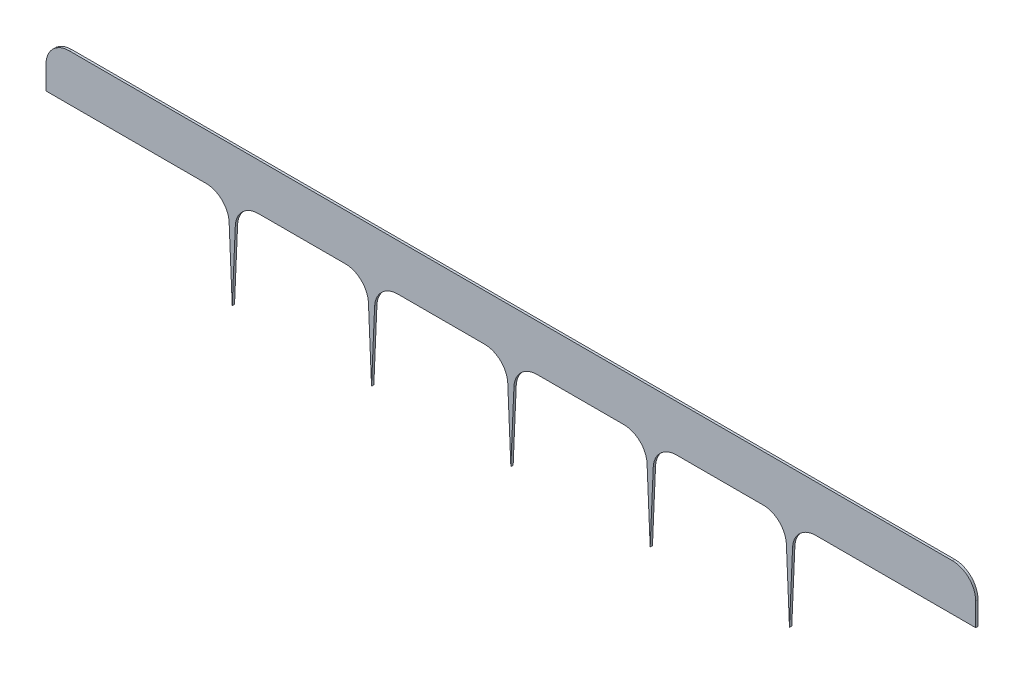
ISO-10303-21;
HEADER;
FILE_DESCRIPTION(('STEP AP214'),'2;1');
FILE_NAME('part.step','',(''),(''),'','','');
FILE_SCHEMA(('AUTOMOTIVE_DESIGN { 1 0 10303 214 1 1 1 1 }'));
ENDSEC;
DATA;
#1=APPLICATION_CONTEXT('core data for automotive mechanical design processes');
#2=APPLICATION_PROTOCOL_DEFINITION('international standard','automotive_design',2000,#1);
#3=PRODUCT_CONTEXT('',#1,'mechanical');
#4=PRODUCT('Part','Part','',(#3));
#5=PRODUCT_RELATED_PRODUCT_CATEGORY('part','',(#4));
#6=PRODUCT_DEFINITION_FORMATION('','',#4);
#7=PRODUCT_DEFINITION_CONTEXT('part definition',#1,'design');
#8=PRODUCT_DEFINITION('design','',#6,#7);
#9=PRODUCT_DEFINITION_SHAPE('','',#8);
#10=(LENGTH_UNIT() NAMED_UNIT(*) SI_UNIT(.MILLI.,.METRE.));
#11=(NAMED_UNIT(*) PLANE_ANGLE_UNIT() SI_UNIT($,.RADIAN.));
#12=(NAMED_UNIT(*) SI_UNIT($,.STERADIAN.) SOLID_ANGLE_UNIT());
#13=UNCERTAINTY_MEASURE_WITH_UNIT(LENGTH_MEASURE(1.E-05),#10,'distance_accuracy_value','');
#14=(GEOMETRIC_REPRESENTATION_CONTEXT(3) GLOBAL_UNCERTAINTY_ASSIGNED_CONTEXT((#13)) GLOBAL_UNIT_ASSIGNED_CONTEXT((#10,
#11,#12)) REPRESENTATION_CONTEXT('',''));
#15=CARTESIAN_POINT('',(0.,0.,0.));
#16=DIRECTION('',(0.,0.,1.));
#17=DIRECTION('',(1.,0.,0.));
#18=AXIS2_PLACEMENT_3D('',#15,#16,#17);
#19=CARTESIAN_POINT('',(8.56424863976529,0.749999999999999,0.025));
#20=DIRECTION('',(0.,0.,-1.));
#21=DIRECTION('',(-1.,0.,0.));
#22=AXIS2_PLACEMENT_3D('',#19,#20,#21);
#23=CYLINDRICAL_SURFACE('',#22,0.250000000000002);
#24=CARTESIAN_POINT('',(8.56424863976529,0.749999999999999,0.));
#25=DIRECTION('',(0.,0.,1.));
#26=DIRECTION('',(1.,0.,0.));
#27=AXIS2_PLACEMENT_3D('',#24,#25,#26);
#28=CIRCLE('',#27,0.250000000000002);
#29=CARTESIAN_POINT('',(8.56424863976529,1.,0.));
#30=VERTEX_POINT('',#29);
#31=CARTESIAN_POINT('',(8.31448658436983,0.760904846841333,0.));
#32=VERTEX_POINT('',#31);
#33=EDGE_CURVE('E272',#30,#32,#28,.T.);
#34=ORIENTED_EDGE('',*,*,#33,.F.);
#35=DIRECTION('',(0.,0.,-1.));
#36=VECTOR('',#35,1.);
#37=CARTESIAN_POINT('',(8.56424863976529,1.,0.025));
#38=LINE('',#37,#36);
#39=CARTESIAN_POINT('',(8.56424863976529,1.,0.025));
#40=VERTEX_POINT('',#39);
#41=EDGE_CURVE('E11',#40,#30,#38,.T.);
#42=ORIENTED_EDGE('',*,*,#41,.F.);
#43=CARTESIAN_POINT('',(8.56424863976529,0.749999999999999,0.025));
#44=DIRECTION('',(0.,0.,1.));
#45=DIRECTION('',(1.,0.,0.));
#46=AXIS2_PLACEMENT_3D('',#43,#44,#45);
#47=CIRCLE('',#46,0.250000000000002);
#48=CARTESIAN_POINT('',(8.31448658436983,0.760904846841333,0.025));
#49=VERTEX_POINT('',#48);
#50=EDGE_CURVE('E354',#40,#49,#47,.T.);
#51=ORIENTED_EDGE('',*,*,#50,.T.);
#52=DIRECTION('',(0.,0.,-1.));
#53=VECTOR('',#52,1.);
#54=CARTESIAN_POINT('',(8.31448658436983,0.760904846841333,0.025));
#55=LINE('',#54,#53);
#56=EDGE_CURVE('E158',#49,#32,#55,.T.);
#57=ORIENTED_EDGE('',*,*,#56,.T.);
#58=EDGE_LOOP('',(#34,#42,#51,#57));
#59=FACE_BOUND('',#58,.T.);
#60=ADVANCED_FACE('F39',(#59),#23,.F.);
#61=CARTESIAN_POINT('',(0.,1.,0.025));
#62=DIRECTION('',(0.,1.,0.));
#63=DIRECTION('',(0.,0.,1.));
#64=AXIS2_PLACEMENT_3D('',#61,#62,#63);
#65=PLANE('',#64);
#66=DIRECTION('',(1.,0.,0.));
#67=VECTOR('',#66,1.);
#68=CARTESIAN_POINT('',(0.,1.,0.));
#69=LINE('',#68,#67);
#70=CARTESIAN_POINT('',(10.2862647612931,1.,0.));
#71=VERTEX_POINT('',#70);
#72=EDGE_CURVE('E275',#30,#71,#69,.T.);
#73=ORIENTED_EDGE('',*,*,#72,.T.);
#74=DIRECTION('',(0.,0.,-1.));
#75=VECTOR('',#74,1.);
#76=CARTESIAN_POINT('',(10.2862647612931,1.,0.025));
#77=LINE('',#76,#75);
#78=CARTESIAN_POINT('',(10.2862647612931,1.,0.025));
#79=VERTEX_POINT('',#78);
#80=EDGE_CURVE('E47',#79,#71,#77,.T.);
#81=ORIENTED_EDGE('',*,*,#80,.F.);
#82=DIRECTION('',(1.,0.,0.));
#83=VECTOR('',#82,1.);
#84=CARTESIAN_POINT('',(0.,1.,0.025));
#85=LINE('',#84,#83);
#86=EDGE_CURVE('E438',#40,#79,#85,.T.);
#87=ORIENTED_EDGE('',*,*,#86,.F.);
#88=ORIENTED_EDGE('',*,*,#41,.T.);
#89=EDGE_LOOP('',(#73,#81,#87,#88));
#90=FACE_BOUND('',#89,.T.);
#91=ADVANCED_FACE('F516',(#90),#65,.F.);
#92=CARTESIAN_POINT('',(10.2862647612931,0.,0.025));
#93=DIRECTION('',(-1.,0.,0.));
#94=DIRECTION('',(0.,0.,1.));
#95=AXIS2_PLACEMENT_3D('',#92,#93,#94);
#96=PLANE('',#95);
#97=DIRECTION('',(0.,1.,0.));
#98=VECTOR('',#97,1.);
#99=CARTESIAN_POINT('',(10.2862647612931,0.,0.));
#100=LINE('',#99,#98);
#101=CARTESIAN_POINT('',(10.2862647612931,1.25,0.));
#102=VERTEX_POINT('',#101);
#103=EDGE_CURVE('E277',#71,#102,#100,.T.);
#104=ORIENTED_EDGE('',*,*,#103,.T.);
#105=DIRECTION('',(0.,0.,-1.));
#106=VECTOR('',#105,1.);
#107=CARTESIAN_POINT('',(10.2862647612931,1.25,0.025));
#108=LINE('',#107,#106);
#109=CARTESIAN_POINT('',(10.2862647612931,1.25,0.025));
#110=VERTEX_POINT('',#109);
#111=EDGE_CURVE('E410',#110,#102,#108,.T.);
#112=ORIENTED_EDGE('',*,*,#111,.F.);
#113=DIRECTION('',(0.,1.,0.));
#114=VECTOR('',#113,1.);
#115=CARTESIAN_POINT('',(10.2862647612931,0.,0.025));
#116=LINE('',#115,#114);
#117=EDGE_CURVE('E419',#79,#110,#116,.T.);
#118=ORIENTED_EDGE('',*,*,#117,.F.);
#119=ORIENTED_EDGE('',*,*,#80,.T.);
#120=EDGE_LOOP('',(#104,#112,#118,#119));
#121=FACE_BOUND('',#120,.T.);
#122=ADVANCED_FACE('F417',(#121),#96,.F.);
#123=CARTESIAN_POINT('',(10.0362647612931,1.25,0.025));
#124=DIRECTION('',(0.,0.,-1.));
#125=DIRECTION('',(-1.,0.,0.));
#126=AXIS2_PLACEMENT_3D('',#123,#124,#125);
#127=CYLINDRICAL_SURFACE('',#126,0.25);
#128=CARTESIAN_POINT('',(10.0362647612931,1.25,0.));
#129=DIRECTION('',(0.,0.,1.));
#130=DIRECTION('',(1.,0.,0.));
#131=AXIS2_PLACEMENT_3D('',#128,#129,#130);
#132=CIRCLE('',#131,0.25);
#133=CARTESIAN_POINT('',(10.0362647612931,1.5,0.));
#134=VERTEX_POINT('',#133);
#135=EDGE_CURVE('E279',#102,#134,#132,.T.);
#136=ORIENTED_EDGE('',*,*,#135,.T.);
#137=DIRECTION('',(0.,0.,-1.));
#138=VECTOR('',#137,1.);
#139=CARTESIAN_POINT('',(10.0362647612931,1.5,0.025));
#140=LINE('',#139,#138);
#141=CARTESIAN_POINT('',(10.0362647612931,1.5,0.025));
#142=VERTEX_POINT('',#141);
#143=EDGE_CURVE('E408',#142,#134,#140,.T.);
#144=ORIENTED_EDGE('',*,*,#143,.F.);
#145=CARTESIAN_POINT('',(10.0362647612931,1.25,0.025));
#146=DIRECTION('',(0.,0.,1.));
#147=DIRECTION('',(1.,0.,0.));
#148=AXIS2_PLACEMENT_3D('',#145,#146,#147);
#149=CIRCLE('',#148,0.25);
#150=EDGE_CURVE('E432',#110,#142,#149,.T.);
#151=ORIENTED_EDGE('',*,*,#150,.F.);
#152=ORIENTED_EDGE('',*,*,#111,.T.);
#153=EDGE_LOOP('',(#136,#144,#151,#152));
#154=FACE_BOUND('',#153,.T.);
#155=ADVANCED_FACE('F429',(#154),#127,.T.);
#156=CARTESIAN_POINT('',(0.,1.5,0.025));
#157=DIRECTION('',(0.,1.,0.));
#158=DIRECTION('',(0.,0.,1.));
#159=AXIS2_PLACEMENT_3D('',#156,#157,#158);
#160=PLANE('',#159);
#161=DIRECTION('',(1.,0.,0.));
#162=VECTOR('',#161,1.);
#163=CARTESIAN_POINT('',(0.,1.5,0.));
#164=LINE('',#163,#162);
#165=CARTESIAN_POINT('',(0.526264761293076,1.5,0.));
#166=VERTEX_POINT('',#165);
#167=EDGE_CURVE('E282',#166,#134,#164,.T.);
#168=ORIENTED_EDGE('',*,*,#167,.F.);
#169=DIRECTION('',(0.,0.,-1.));
#170=VECTOR('',#169,1.);
#171=CARTESIAN_POINT('',(0.526264761293076,1.5,0.025));
#172=LINE('',#171,#170);
#173=CARTESIAN_POINT('',(0.526264761293076,1.5,0.025));
#174=VERTEX_POINT('',#173);
#175=EDGE_CURVE('E406',#174,#166,#172,.T.);
#176=ORIENTED_EDGE('',*,*,#175,.F.);
#177=DIRECTION('',(1.,0.,0.));
#178=VECTOR('',#177,1.);
#179=CARTESIAN_POINT('',(0.,1.5,0.025));
#180=LINE('',#179,#178);
#181=EDGE_CURVE('E434',#174,#142,#180,.T.);
#182=ORIENTED_EDGE('',*,*,#181,.T.);
#183=ORIENTED_EDGE('',*,*,#143,.T.);
#184=EDGE_LOOP('',(#168,#176,#182,#183));
#185=FACE_BOUND('',#184,.T.);
#186=ADVANCED_FACE('F776',(#185),#160,.T.);
#187=CARTESIAN_POINT('',(0.526264761293076,1.25,0.025));
#188=DIRECTION('',(0.,0.,-1.));
#189=DIRECTION('',(-1.,0.,0.));
#190=AXIS2_PLACEMENT_3D('',#187,#188,#189);
#191=CYLINDRICAL_SURFACE('',#190,0.25);
#192=CARTESIAN_POINT('',(0.526264761293076,1.25,0.));
#193=DIRECTION('',(0.,0.,1.));
#194=DIRECTION('',(1.,0.,0.));
#195=AXIS2_PLACEMENT_3D('',#192,#193,#194);
#196=CIRCLE('',#195,0.25);
#197=CARTESIAN_POINT('',(0.276264761293076,1.25,0.));
#198=VERTEX_POINT('',#197);
#199=EDGE_CURVE('E285',#166,#198,#196,.T.);
#200=ORIENTED_EDGE('',*,*,#199,.T.);
#201=DIRECTION('',(0.,0.,-1.));
#202=VECTOR('',#201,1.);
#203=CARTESIAN_POINT('',(0.276264761293076,1.25,0.025));
#204=LINE('',#203,#202);
#205=CARTESIAN_POINT('',(0.276264761293076,1.25,0.025));
#206=VERTEX_POINT('',#205);
#207=EDGE_CURVE('E404',#206,#198,#204,.T.);
#208=ORIENTED_EDGE('',*,*,#207,.F.);
#209=CARTESIAN_POINT('',(0.526264761293076,1.25,0.025));
#210=DIRECTION('',(0.,0.,1.));
#211=DIRECTION('',(1.,0.,0.));
#212=AXIS2_PLACEMENT_3D('',#209,#210,#211);
#213=CIRCLE('',#212,0.25);
#214=EDGE_CURVE('E436',#174,#206,#213,.T.);
#215=ORIENTED_EDGE('',*,*,#214,.F.);
#216=ORIENTED_EDGE('',*,*,#175,.T.);
#217=EDGE_LOOP('',(#200,#208,#215,#216));
#218=FACE_BOUND('',#217,.T.);
#219=ADVANCED_FACE('F765',(#218),#191,.T.);
#220=CARTESIAN_POINT('',(0.276264761293076,0.,0.025));
#221=DIRECTION('',(-1.,0.,0.));
#222=DIRECTION('',(0.,0.,1.));
#223=AXIS2_PLACEMENT_3D('',#220,#221,#222);
#224=PLANE('',#223);
#225=DIRECTION('',(0.,1.,0.));
#226=VECTOR('',#225,1.);
#227=CARTESIAN_POINT('',(0.276264761293076,0.,0.));
#228=LINE('',#227,#226);
#229=CARTESIAN_POINT('',(0.276264761293076,1.,0.));
#230=VERTEX_POINT('',#229);
#231=EDGE_CURVE('E288',#230,#198,#228,.T.);
#232=ORIENTED_EDGE('',*,*,#231,.F.);
#233=DIRECTION('',(0.,0.,-1.));
#234=VECTOR('',#233,1.);
#235=CARTESIAN_POINT('',(0.276264761293076,1.,0.025));
#236=LINE('',#235,#234);
#237=CARTESIAN_POINT('',(0.276264761293076,1.,0.025));
#238=VERTEX_POINT('',#237);
#239=EDGE_CURVE('E402',#238,#230,#236,.T.);
#240=ORIENTED_EDGE('',*,*,#239,.F.);
#241=DIRECTION('',(0.,1.,0.));
#242=VECTOR('',#241,1.);
#243=CARTESIAN_POINT('',(0.276264761293076,0.,0.025));
#244=LINE('',#243,#242);
#245=EDGE_CURVE('E443',#238,#206,#244,.T.);
#246=ORIENTED_EDGE('',*,*,#245,.T.);
#247=ORIENTED_EDGE('',*,*,#207,.T.);
#248=EDGE_LOOP('',(#232,#240,#246,#247));
#249=FACE_BOUND('',#248,.T.);
#250=ADVANCED_FACE('F754',(#249),#224,.T.);
#251=CARTESIAN_POINT('',(0.,1.,0.025));
#252=DIRECTION('',(0.,-1.,0.));
#253=DIRECTION('',(1.,0.,0.));
#254=AXIS2_PLACEMENT_3D('',#251,#252,#253);
#255=PLANE('',#254);
#256=DIRECTION('',(-1.,0.,0.));
#257=VECTOR('',#256,1.);
#258=CARTESIAN_POINT('',(0.,1.,0.));
#259=LINE('',#258,#257);
#260=CARTESIAN_POINT('',(1.99828088282086,1.,0.));
#261=VERTEX_POINT('',#260);
#262=EDGE_CURVE('E291',#261,#230,#259,.T.);
#263=ORIENTED_EDGE('',*,*,#262,.F.);
#264=DIRECTION('',(0.,0.,-1.));
#265=VECTOR('',#264,1.);
#266=CARTESIAN_POINT('',(1.99828088282086,1.,0.025));
#267=LINE('',#266,#265);
#268=CARTESIAN_POINT('',(1.99828088282086,1.,0.025));
#269=VERTEX_POINT('',#268);
#270=EDGE_CURVE('E400',#269,#261,#267,.T.);
#271=ORIENTED_EDGE('',*,*,#270,.F.);
#272=DIRECTION('',(-1.,0.,0.));
#273=VECTOR('',#272,1.);
#274=CARTESIAN_POINT('',(0.,1.,0.025));
#275=LINE('',#274,#273);
#276=EDGE_CURVE('E446',#269,#238,#275,.T.);
#277=ORIENTED_EDGE('',*,*,#276,.T.);
#278=ORIENTED_EDGE('',*,*,#239,.T.);
#279=EDGE_LOOP('',(#263,#271,#277,#278));
#280=FACE_BOUND('',#279,.T.);
#281=ADVANCED_FACE('F744',(#280),#255,.T.);
#282=CARTESIAN_POINT('',(1.99828088282086,0.75,0.025));
#283=DIRECTION('',(0.,0.,-1.));
#284=DIRECTION('',(-1.,0.,0.));
#285=AXIS2_PLACEMENT_3D('',#282,#283,#284);
#286=CYLINDRICAL_SURFACE('',#285,0.25);
#287=CARTESIAN_POINT('',(1.99828088282086,0.75,0.));
#288=DIRECTION('',(0.,0.,1.));
#289=DIRECTION('',(1.,0.,0.));
#290=AXIS2_PLACEMENT_3D('',#287,#288,#289);
#291=CIRCLE('',#290,0.25);
#292=CARTESIAN_POINT('',(2.24804293821632,0.760904846841333,0.));
#293=VERTEX_POINT('',#292);
#294=EDGE_CURVE('E294',#293,#261,#291,.T.);
#295=ORIENTED_EDGE('',*,*,#294,.F.);
#296=DIRECTION('',(0.,0.,-1.));
#297=VECTOR('',#296,1.);
#298=CARTESIAN_POINT('',(2.24804293821632,0.760904846841333,0.025));
#299=LINE('',#298,#297);
#300=CARTESIAN_POINT('',(2.24804293821632,0.760904846841333,0.025));
#301=VERTEX_POINT('',#300);
#302=EDGE_CURVE('E398',#301,#293,#299,.T.);
#303=ORIENTED_EDGE('',*,*,#302,.F.);
#304=CARTESIAN_POINT('',(1.99828088282086,0.75,0.025));
#305=DIRECTION('',(0.,0.,1.));
#306=DIRECTION('',(1.,0.,0.));
#307=AXIS2_PLACEMENT_3D('',#304,#305,#306);
#308=CIRCLE('',#307,0.25);
#309=EDGE_CURVE('E449',#301,#269,#308,.T.);
#310=ORIENTED_EDGE('',*,*,#309,.T.);
#311=ORIENTED_EDGE('',*,*,#270,.T.);
#312=EDGE_LOOP('',(#295,#303,#310,#311));
#313=FACE_BOUND('',#312,.T.);
#314=ADVANCED_FACE('F734',(#313),#286,.F.);
#315=CARTESIAN_POINT('',(2.27692431071838,0.0994126623372836,0.025));
#316=DIRECTION('',(0.999048221581858,0.0436193873653382,0.));
#317=DIRECTION('',(-0.0436193873653382,0.999048221581858,0.));
#318=AXIS2_PLACEMENT_3D('',#315,#316,#317);
#319=PLANE('',#318);
#320=DIRECTION('',(0.0436193873653382,-0.999048221581858,0.));
#321=VECTOR('',#320,1.);
#322=CARTESIAN_POINT('',(2.27692431071838,0.0994126623372836,0.));
#323=LINE('',#322,#321);
#324=CARTESIAN_POINT('',(2.28126476129308,0.,0.));
#325=VERTEX_POINT('',#324);
#326=EDGE_CURVE('E297',#293,#325,#323,.T.);
#327=ORIENTED_EDGE('',*,*,#326,.T.);
#328=DIRECTION('',(0.,0.,-1.));
#329=VECTOR('',#328,1.);
#330=CARTESIAN_POINT('',(2.28126476129308,0.,0.025));
#331=LINE('',#330,#329);
#332=CARTESIAN_POINT('',(2.28126476129308,0.,0.025));
#333=VERTEX_POINT('',#332);
#334=EDGE_CURVE('E395',#333,#325,#331,.T.);
#335=ORIENTED_EDGE('',*,*,#334,.F.);
#336=DIRECTION('',(0.0436193873653382,-0.999048221581858,0.));
#337=VECTOR('',#336,1.);
#338=CARTESIAN_POINT('',(2.27692431071838,0.0994126623372836,0.025));
#339=LINE('',#338,#337);
#340=EDGE_CURVE('E452',#301,#333,#339,.T.);
#341=ORIENTED_EDGE('',*,*,#340,.F.);
#342=ORIENTED_EDGE('',*,*,#302,.T.);
#343=EDGE_LOOP('',(#327,#335,#341,#342));
#344=FACE_BOUND('',#343,.T.);
#345=ADVANCED_FACE('F724',(#344),#319,.F.);
#346=CARTESIAN_POINT('',(2.27692431071838,-0.0994126623372706,0.025));
#347=DIRECTION('',(-0.999048221581858,0.0436193873653325,0.));
#348=DIRECTION('',(-0.0436193873653325,-0.999048221581858,0.));
#349=AXIS2_PLACEMENT_3D('',#346,#347,#348);
#350=PLANE('',#349);
#351=DIRECTION('',(0.0436193873653325,0.999048221581858,0.));
#352=VECTOR('',#351,1.);
#353=CARTESIAN_POINT('',(2.27692431071838,-0.0994126623372706,0.));
#354=LINE('',#353,#352);
#355=CARTESIAN_POINT('',(2.31448658436982,0.760904846841333,0.));
#356=VERTEX_POINT('',#355);
#357=EDGE_CURVE('E299',#325,#356,#354,.T.);
#358=ORIENTED_EDGE('',*,*,#357,.T.);
#359=DIRECTION('',(0.,0.,-1.));
#360=VECTOR('',#359,1.);
#361=CARTESIAN_POINT('',(2.31448658436982,0.760904846841333,0.025));
#362=LINE('',#361,#360);
#363=CARTESIAN_POINT('',(2.31448658436982,0.760904846841333,0.025));
#364=VERTEX_POINT('',#363);
#365=EDGE_CURVE('E393',#364,#356,#362,.T.);
#366=ORIENTED_EDGE('',*,*,#365,.F.);
#367=DIRECTION('',(0.0436193873653325,0.999048221581858,0.));
#368=VECTOR('',#367,1.);
#369=CARTESIAN_POINT('',(2.27692431071838,-0.0994126623372706,0.025));
#370=LINE('',#369,#368);
#371=EDGE_CURVE('E454',#333,#364,#370,.T.);
#372=ORIENTED_EDGE('',*,*,#371,.F.);
#373=ORIENTED_EDGE('',*,*,#334,.T.);
#374=EDGE_LOOP('',(#358,#366,#372,#373));
#375=FACE_BOUND('',#374,.T.);
#376=ADVANCED_FACE('F714',(#375),#350,.F.);
#377=CARTESIAN_POINT('',(2.56424863976529,0.749999999999999,0.025));
#378=DIRECTION('',(0.,0.,-1.));
#379=DIRECTION('',(-1.,0.,0.));
#380=AXIS2_PLACEMENT_3D('',#377,#378,#379);
#381=CYLINDRICAL_SURFACE('',#380,0.250000000000001);
#382=CARTESIAN_POINT('',(2.56424863976529,0.749999999999999,0.));
#383=DIRECTION('',(0.,0.,1.));
#384=DIRECTION('',(1.,0.,0.));
#385=AXIS2_PLACEMENT_3D('',#382,#383,#384);
#386=CIRCLE('',#385,0.250000000000001);
#387=CARTESIAN_POINT('',(2.56424863976529,1.,0.));
#388=VERTEX_POINT('',#387);
#389=EDGE_CURVE('E302',#388,#356,#386,.T.);
#390=ORIENTED_EDGE('',*,*,#389,.F.);
#391=DIRECTION('',(0.,0.,-1.));
#392=VECTOR('',#391,1.);
#393=CARTESIAN_POINT('',(2.56424863976529,1.,0.025));
#394=LINE('',#393,#392);
#395=CARTESIAN_POINT('',(2.56424863976529,1.,0.025));
#396=VERTEX_POINT('',#395);
#397=EDGE_CURVE('E391',#396,#388,#394,.T.);
#398=ORIENTED_EDGE('',*,*,#397,.F.);
#399=CARTESIAN_POINT('',(2.56424863976529,0.749999999999999,0.025));
#400=DIRECTION('',(0.,0.,1.));
#401=DIRECTION('',(1.,0.,0.));
#402=AXIS2_PLACEMENT_3D('',#399,#400,#401);
#403=CIRCLE('',#402,0.250000000000001);
#404=EDGE_CURVE('E456',#396,#364,#403,.T.);
#405=ORIENTED_EDGE('',*,*,#404,.T.);
#406=ORIENTED_EDGE('',*,*,#365,.T.);
#407=EDGE_LOOP('',(#390,#398,#405,#406));
#408=FACE_BOUND('',#407,.T.);
#409=ADVANCED_FACE('F704',(#408),#381,.F.);
#410=CARTESIAN_POINT('',(0.,1.,0.025));
#411=DIRECTION('',(0.,1.,0.));
#412=DIRECTION('',(0.,0.,1.));
#413=AXIS2_PLACEMENT_3D('',#410,#411,#412);
#414=PLANE('',#413);
#415=DIRECTION('',(1.,0.,0.));
#416=VECTOR('',#415,1.);
#417=CARTESIAN_POINT('',(0.,1.,0.));
#418=LINE('',#417,#416);
#419=CARTESIAN_POINT('',(3.49828088282086,1.,0.));
#420=VERTEX_POINT('',#419);
#421=EDGE_CURVE('E305',#388,#420,#418,.T.);
#422=ORIENTED_EDGE('',*,*,#421,.T.);
#423=DIRECTION('',(0.,0.,-1.));
#424=VECTOR('',#423,1.);
#425=CARTESIAN_POINT('',(3.49828088282086,1.,0.025));
#426=LINE('',#425,#424);
#427=CARTESIAN_POINT('',(3.49828088282086,1.,0.025));
#428=VERTEX_POINT('',#427);
#429=EDGE_CURVE('E389',#428,#420,#426,.T.);
#430=ORIENTED_EDGE('',*,*,#429,.F.);
#431=DIRECTION('',(1.,0.,0.));
#432=VECTOR('',#431,1.);
#433=CARTESIAN_POINT('',(0.,1.,0.025));
#434=LINE('',#433,#432);
#435=EDGE_CURVE('E459',#396,#428,#434,.T.);
#436=ORIENTED_EDGE('',*,*,#435,.F.);
#437=ORIENTED_EDGE('',*,*,#397,.T.);
#438=EDGE_LOOP('',(#422,#430,#436,#437));
#439=FACE_BOUND('',#438,.T.);
#440=ADVANCED_FACE('F694',(#439),#414,.F.);
#441=CARTESIAN_POINT('',(3.49828088282086,0.75,0.025));
#442=DIRECTION('',(0.,0.,-1.));
#443=DIRECTION('',(-1.,0.,0.));
#444=AXIS2_PLACEMENT_3D('',#441,#442,#443);
#445=CYLINDRICAL_SURFACE('',#444,0.25);
#446=CARTESIAN_POINT('',(3.49828088282086,0.75,0.));
#447=DIRECTION('',(0.,0.,1.));
#448=DIRECTION('',(1.,0.,0.));
#449=AXIS2_PLACEMENT_3D('',#446,#447,#448);
#450=CIRCLE('',#449,0.25);
#451=CARTESIAN_POINT('',(3.74804293821632,0.760904846841333,0.));
#452=VERTEX_POINT('',#451);
#453=EDGE_CURVE('E308',#452,#420,#450,.T.);
#454=ORIENTED_EDGE('',*,*,#453,.F.);
#455=DIRECTION('',(0.,0.,-1.));
#456=VECTOR('',#455,1.);
#457=CARTESIAN_POINT('',(3.74804293821632,0.760904846841333,0.025));
#458=LINE('',#457,#456);
#459=CARTESIAN_POINT('',(3.74804293821632,0.760904846841333,0.025));
#460=VERTEX_POINT('',#459);
#461=EDGE_CURVE('E387',#460,#452,#458,.T.);
#462=ORIENTED_EDGE('',*,*,#461,.F.);
#463=CARTESIAN_POINT('',(3.49828088282086,0.75,0.025));
#464=DIRECTION('',(0.,0.,1.));
#465=DIRECTION('',(1.,0.,0.));
#466=AXIS2_PLACEMENT_3D('',#463,#464,#465);
#467=CIRCLE('',#466,0.25);
#468=EDGE_CURVE('E461',#460,#428,#467,.T.);
#469=ORIENTED_EDGE('',*,*,#468,.T.);
#470=ORIENTED_EDGE('',*,*,#429,.T.);
#471=EDGE_LOOP('',(#454,#462,#469,#470));
#472=FACE_BOUND('',#471,.T.);
#473=ADVANCED_FACE('F684',(#472),#445,.F.);
#474=CARTESIAN_POINT('',(3.77407033428719,0.164779469398035,0.025));
#475=DIRECTION('',(0.999048221581858,0.0436193873653393,0.));
#476=DIRECTION('',(-0.0436193873653393,0.999048221581858,0.));
#477=AXIS2_PLACEMENT_3D('',#474,#475,#476);
#478=PLANE('',#477);
#479=DIRECTION('',(0.0436193873653393,-0.999048221581858,0.));
#480=VECTOR('',#479,1.);
#481=CARTESIAN_POINT('',(3.77407033428719,0.164779469398035,0.));
#482=LINE('',#481,#480);
#483=CARTESIAN_POINT('',(3.78126476129308,0.,0.));
#484=VERTEX_POINT('',#483);
#485=EDGE_CURVE('E311',#452,#484,#482,.T.);
#486=ORIENTED_EDGE('',*,*,#485,.T.);
#487=DIRECTION('',(0.,0.,-1.));
#488=VECTOR('',#487,1.);
#489=CARTESIAN_POINT('',(3.78126476129308,0.,0.025));
#490=LINE('',#489,#488);
#491=CARTESIAN_POINT('',(3.78126476129308,0.,0.025));
#492=VERTEX_POINT('',#491);
#493=EDGE_CURVE('E384',#492,#484,#490,.T.);
#494=ORIENTED_EDGE('',*,*,#493,.F.);
#495=DIRECTION('',(0.0436193873653393,-0.999048221581858,0.));
#496=VECTOR('',#495,1.);
#497=CARTESIAN_POINT('',(3.77407033428719,0.164779469398035,0.025));
#498=LINE('',#497,#496);
#499=EDGE_CURVE('E464',#460,#492,#498,.T.);
#500=ORIENTED_EDGE('',*,*,#499,.F.);
#501=ORIENTED_EDGE('',*,*,#461,.T.);
#502=EDGE_LOOP('',(#486,#494,#500,#501));
#503=FACE_BOUND('',#502,.T.);
#504=ADVANCED_FACE('F674',(#503),#478,.F.);
#505=CARTESIAN_POINT('',(3.77407033428719,-0.164779469398013,0.025));
#506=DIRECTION('',(-0.999048221581858,0.0436193873653336,0.));
#507=DIRECTION('',(-0.0436193873653337,-0.999048221581858,0.));
#508=AXIS2_PLACEMENT_3D('',#505,#506,#507);
#509=PLANE('',#508);
#510=DIRECTION('',(0.0436193873653337,0.999048221581858,0.));
#511=VECTOR('',#510,1.);
#512=CARTESIAN_POINT('',(3.77407033428719,-0.164779469398013,0.));
#513=LINE('',#512,#511);
#514=CARTESIAN_POINT('',(3.81448658436982,0.760904846841333,0.));
#515=VERTEX_POINT('',#514);
#516=EDGE_CURVE('E313',#484,#515,#513,.T.);
#517=ORIENTED_EDGE('',*,*,#516,.T.);
#518=DIRECTION('',(0.,0.,-1.));
#519=VECTOR('',#518,1.);
#520=CARTESIAN_POINT('',(3.81448658436982,0.760904846841333,0.025));
#521=LINE('',#520,#519);
#522=CARTESIAN_POINT('',(3.81448658436982,0.760904846841333,0.025));
#523=VERTEX_POINT('',#522);
#524=EDGE_CURVE('E382',#523,#515,#521,.T.);
#525=ORIENTED_EDGE('',*,*,#524,.F.);
#526=DIRECTION('',(0.0436193873653337,0.999048221581858,0.));
#527=VECTOR('',#526,1.);
#528=CARTESIAN_POINT('',(3.77407033428719,-0.164779469398013,0.025));
#529=LINE('',#528,#527);
#530=EDGE_CURVE('E466',#492,#523,#529,.T.);
#531=ORIENTED_EDGE('',*,*,#530,.F.);
#532=ORIENTED_EDGE('',*,*,#493,.T.);
#533=EDGE_LOOP('',(#517,#525,#531,#532));
#534=FACE_BOUND('',#533,.T.);
#535=ADVANCED_FACE('F664',(#534),#509,.F.);
#536=CARTESIAN_POINT('',(4.06424863976529,0.749999999999999,0.025));
#537=DIRECTION('',(0.,0.,-1.));
#538=DIRECTION('',(-1.,0.,0.));
#539=AXIS2_PLACEMENT_3D('',#536,#537,#538);
#540=CYLINDRICAL_SURFACE('',#539,0.250000000000001);
#541=CARTESIAN_POINT('',(4.06424863976529,0.749999999999999,0.));
#542=DIRECTION('',(0.,0.,1.));
#543=DIRECTION('',(1.,0.,0.));
#544=AXIS2_PLACEMENT_3D('',#541,#542,#543);
#545=CIRCLE('',#544,0.250000000000001);
#546=CARTESIAN_POINT('',(4.06424863976529,1.,0.));
#547=VERTEX_POINT('',#546);
#548=EDGE_CURVE('E316',#547,#515,#545,.T.);
#549=ORIENTED_EDGE('',*,*,#548,.F.);
#550=DIRECTION('',(0.,0.,-1.));
#551=VECTOR('',#550,1.);
#552=CARTESIAN_POINT('',(4.06424863976529,1.,0.025));
#553=LINE('',#552,#551);
#554=CARTESIAN_POINT('',(4.06424863976529,1.,0.025));
#555=VERTEX_POINT('',#554);
#556=EDGE_CURVE('E380',#555,#547,#553,.T.);
#557=ORIENTED_EDGE('',*,*,#556,.F.);
#558=CARTESIAN_POINT('',(4.06424863976529,0.749999999999999,0.025));
#559=DIRECTION('',(0.,0.,1.));
#560=DIRECTION('',(1.,0.,0.));
#561=AXIS2_PLACEMENT_3D('',#558,#559,#560);
#562=CIRCLE('',#561,0.250000000000001);
#563=EDGE_CURVE('E468',#555,#523,#562,.T.);
#564=ORIENTED_EDGE('',*,*,#563,.T.);
#565=ORIENTED_EDGE('',*,*,#524,.T.);
#566=EDGE_LOOP('',(#549,#557,#564,#565));
#567=FACE_BOUND('',#566,.T.);
#568=ADVANCED_FACE('F654',(#567),#540,.F.);
#569=CARTESIAN_POINT('',(0.,1.,0.025));
#570=DIRECTION('',(0.,1.,0.));
#571=DIRECTION('',(0.,0.,1.));
#572=AXIS2_PLACEMENT_3D('',#569,#570,#571);
#573=PLANE('',#572);
#574=DIRECTION('',(1.,0.,0.));
#575=VECTOR('',#574,1.);
#576=CARTESIAN_POINT('',(0.,1.,0.));
#577=LINE('',#576,#575);
#578=CARTESIAN_POINT('',(4.99828088282086,1.,0.));
#579=VERTEX_POINT('',#578);
#580=EDGE_CURVE('E319',#547,#579,#577,.T.);
#581=ORIENTED_EDGE('',*,*,#580,.T.);
#582=DIRECTION('',(0.,0.,-1.));
#583=VECTOR('',#582,1.);
#584=CARTESIAN_POINT('',(4.99828088282086,1.,0.025));
#585=LINE('',#584,#583);
#586=CARTESIAN_POINT('',(4.99828088282086,1.,0.025));
#587=VERTEX_POINT('',#586);
#588=EDGE_CURVE('E378',#587,#579,#585,.T.);
#589=ORIENTED_EDGE('',*,*,#588,.F.);
#590=DIRECTION('',(1.,0.,0.));
#591=VECTOR('',#590,1.);
#592=CARTESIAN_POINT('',(0.,1.,0.025));
#593=LINE('',#592,#591);
#594=EDGE_CURVE('E471',#555,#587,#593,.T.);
#595=ORIENTED_EDGE('',*,*,#594,.F.);
#596=ORIENTED_EDGE('',*,*,#556,.T.);
#597=EDGE_LOOP('',(#581,#589,#595,#596));
#598=FACE_BOUND('',#597,.T.);
#599=ADVANCED_FACE('F644',(#598),#573,.F.);
#600=CARTESIAN_POINT('',(4.99828088282086,0.75,0.025));
#601=DIRECTION('',(0.,0.,-1.));
#602=DIRECTION('',(-1.,0.,0.));
#603=AXIS2_PLACEMENT_3D('',#600,#601,#602);
#604=CYLINDRICAL_SURFACE('',#603,0.25);
#605=CARTESIAN_POINT('',(4.99828088282086,0.75,0.));
#606=DIRECTION('',(0.,0.,1.));
#607=DIRECTION('',(1.,0.,0.));
#608=AXIS2_PLACEMENT_3D('',#605,#606,#607);
#609=CIRCLE('',#608,0.25);
#610=CARTESIAN_POINT('',(5.24804293821632,0.760904846841333,0.));
#611=VERTEX_POINT('',#610);
#612=EDGE_CURVE('E322',#611,#579,#609,.T.);
#613=ORIENTED_EDGE('',*,*,#612,.F.);
#614=DIRECTION('',(0.,0.,-1.));
#615=VECTOR('',#614,1.);
#616=CARTESIAN_POINT('',(5.24804293821632,0.760904846841333,0.025));
#617=LINE('',#616,#615);
#618=CARTESIAN_POINT('',(5.24804293821632,0.760904846841333,0.025));
#619=VERTEX_POINT('',#618);
#620=EDGE_CURVE('E376',#619,#611,#617,.T.);
#621=ORIENTED_EDGE('',*,*,#620,.F.);
#622=CARTESIAN_POINT('',(4.99828088282086,0.75,0.025));
#623=DIRECTION('',(0.,0.,1.));
#624=DIRECTION('',(1.,0.,0.));
#625=AXIS2_PLACEMENT_3D('',#622,#623,#624);
#626=CIRCLE('',#625,0.25);
#627=EDGE_CURVE('E473',#619,#587,#626,.T.);
#628=ORIENTED_EDGE('',*,*,#627,.T.);
#629=ORIENTED_EDGE('',*,*,#588,.T.);
#630=EDGE_LOOP('',(#613,#621,#628,#629));
#631=FACE_BOUND('',#630,.T.);
#632=ADVANCED_FACE('F634',(#631),#604,.F.);
#633=CARTESIAN_POINT('',(5.271216357856,0.23014627645878,0.025));
#634=DIRECTION('',(0.999048221581858,0.0436193873653388,0.));
#635=DIRECTION('',(-0.0436193873653388,0.999048221581858,0.));
#636=AXIS2_PLACEMENT_3D('',#633,#634,#635);
#637=PLANE('',#636);
#638=DIRECTION('',(0.0436193873653388,-0.999048221581858,0.));
#639=VECTOR('',#638,1.);
#640=CARTESIAN_POINT('',(5.271216357856,0.23014627645878,0.));
#641=LINE('',#640,#639);
#642=CARTESIAN_POINT('',(5.28126476129308,0.,0.));
#643=VERTEX_POINT('',#642);
#644=EDGE_CURVE('E325',#611,#643,#641,.T.);
#645=ORIENTED_EDGE('',*,*,#644,.T.);
#646=DIRECTION('',(0.,0.,-1.));
#647=VECTOR('',#646,1.);
#648=CARTESIAN_POINT('',(5.28126476129308,0.,0.025));
#649=LINE('',#648,#647);
#650=CARTESIAN_POINT('',(5.28126476129308,0.,0.025));
#651=VERTEX_POINT('',#650);
#652=EDGE_CURVE('E373',#651,#643,#649,.T.);
#653=ORIENTED_EDGE('',*,*,#652,.F.);
#654=DIRECTION('',(0.0436193873653388,-0.999048221581858,0.));
#655=VECTOR('',#654,1.);
#656=CARTESIAN_POINT('',(5.271216357856,0.23014627645878,0.025));
#657=LINE('',#656,#655);
#658=EDGE_CURVE('E476',#619,#651,#657,.T.);
#659=ORIENTED_EDGE('',*,*,#658,.F.);
#660=ORIENTED_EDGE('',*,*,#620,.T.);
#661=EDGE_LOOP('',(#645,#653,#659,#660));
#662=FACE_BOUND('',#661,.T.);
#663=ADVANCED_FACE('F624',(#662),#637,.F.);
#664=CARTESIAN_POINT('',(5.271216357856,-0.230146276458762,0.025));
#665=DIRECTION('',(-0.999048221581858,0.0436193873653353,0.));
#666=DIRECTION('',(-0.0436193873653353,-0.999048221581858,0.));
#667=AXIS2_PLACEMENT_3D('',#664,#665,#666);
#668=PLANE('',#667);
#669=DIRECTION('',(0.0436193873653353,0.999048221581858,0.));
#670=VECTOR('',#669,1.);
#671=CARTESIAN_POINT('',(5.271216357856,-0.230146276458762,0.));
#672=LINE('',#671,#670);
#673=CARTESIAN_POINT('',(5.31448658436983,0.760904846841333,0.));
#674=VERTEX_POINT('',#673);
#675=EDGE_CURVE('E327',#643,#674,#672,.T.);
#676=ORIENTED_EDGE('',*,*,#675,.T.);
#677=DIRECTION('',(0.,0.,-1.));
#678=VECTOR('',#677,1.);
#679=CARTESIAN_POINT('',(5.31448658436983,0.760904846841333,0.025));
#680=LINE('',#679,#678);
#681=CARTESIAN_POINT('',(5.31448658436983,0.760904846841333,0.025));
#682=VERTEX_POINT('',#681);
#683=EDGE_CURVE('E371',#682,#674,#680,.T.);
#684=ORIENTED_EDGE('',*,*,#683,.F.);
#685=DIRECTION('',(0.0436193873653353,0.999048221581858,0.));
#686=VECTOR('',#685,1.);
#687=CARTESIAN_POINT('',(5.271216357856,-0.230146276458762,0.025));
#688=LINE('',#687,#686);
#689=EDGE_CURVE('E478',#651,#682,#688,.T.);
#690=ORIENTED_EDGE('',*,*,#689,.F.);
#691=ORIENTED_EDGE('',*,*,#652,.T.);
#692=EDGE_LOOP('',(#676,#684,#690,#691));
#693=FACE_BOUND('',#692,.T.);
#694=ADVANCED_FACE('F614',(#693),#668,.F.);
#695=CARTESIAN_POINT('',(5.56424863976529,0.749999999999999,0.025));
#696=DIRECTION('',(0.,0.,-1.));
#697=DIRECTION('',(-1.,0.,0.));
#698=AXIS2_PLACEMENT_3D('',#695,#696,#697);
#699=CYLINDRICAL_SURFACE('',#698,0.250000000000001);
#700=CARTESIAN_POINT('',(5.56424863976529,0.749999999999999,0.));
#701=DIRECTION('',(0.,0.,1.));
#702=DIRECTION('',(1.,0.,0.));
#703=AXIS2_PLACEMENT_3D('',#700,#701,#702);
#704=CIRCLE('',#703,0.250000000000001);
#705=CARTESIAN_POINT('',(5.56424863976529,1.,0.));
#706=VERTEX_POINT('',#705);
#707=EDGE_CURVE('E330',#706,#674,#704,.T.);
#708=ORIENTED_EDGE('',*,*,#707,.F.);
#709=DIRECTION('',(0.,0.,-1.));
#710=VECTOR('',#709,1.);
#711=CARTESIAN_POINT('',(5.56424863976529,1.,0.025));
#712=LINE('',#711,#710);
#713=CARTESIAN_POINT('',(5.56424863976529,1.,0.025));
#714=VERTEX_POINT('',#713);
#715=EDGE_CURVE('E369',#714,#706,#712,.T.);
#716=ORIENTED_EDGE('',*,*,#715,.F.);
#717=CARTESIAN_POINT('',(5.56424863976529,0.749999999999999,0.025));
#718=DIRECTION('',(0.,0.,1.));
#719=DIRECTION('',(1.,0.,0.));
#720=AXIS2_PLACEMENT_3D('',#717,#718,#719);
#721=CIRCLE('',#720,0.250000000000001);
#722=EDGE_CURVE('E480',#714,#682,#721,.T.);
#723=ORIENTED_EDGE('',*,*,#722,.T.);
#724=ORIENTED_EDGE('',*,*,#683,.T.);
#725=EDGE_LOOP('',(#708,#716,#723,#724));
#726=FACE_BOUND('',#725,.T.);
#727=ADVANCED_FACE('F604',(#726),#699,.F.);
#728=CARTESIAN_POINT('',(0.,1.,0.025));
#729=DIRECTION('',(0.,1.,0.));
#730=DIRECTION('',(0.,0.,1.));
#731=AXIS2_PLACEMENT_3D('',#728,#729,#730);
#732=PLANE('',#731);
#733=DIRECTION('',(1.,0.,0.));
#734=VECTOR('',#733,1.);
#735=CARTESIAN_POINT('',(0.,1.,0.));
#736=LINE('',#735,#734);
#737=CARTESIAN_POINT('',(6.49828088282086,1.,0.));
#738=VERTEX_POINT('',#737);
#739=EDGE_CURVE('E333',#706,#738,#736,.T.);
#740=ORIENTED_EDGE('',*,*,#739,.T.);
#741=DIRECTION('',(0.,0.,-1.));
#742=VECTOR('',#741,1.);
#743=CARTESIAN_POINT('',(6.49828088282086,1.,0.025));
#744=LINE('',#743,#742);
#745=CARTESIAN_POINT('',(6.49828088282086,1.,0.025));
#746=VERTEX_POINT('',#745);
#747=EDGE_CURVE('E367',#746,#738,#744,.T.);
#748=ORIENTED_EDGE('',*,*,#747,.F.);
#749=DIRECTION('',(1.,0.,0.));
#750=VECTOR('',#749,1.);
#751=CARTESIAN_POINT('',(0.,1.,0.025));
#752=LINE('',#751,#750);
#753=EDGE_CURVE('E483',#714,#746,#752,.T.);
#754=ORIENTED_EDGE('',*,*,#753,.F.);
#755=ORIENTED_EDGE('',*,*,#715,.T.);
#756=EDGE_LOOP('',(#740,#748,#754,#755));
#757=FACE_BOUND('',#756,.T.);
#758=ADVANCED_FACE('F594',(#757),#732,.F.);
#759=CARTESIAN_POINT('',(6.49828088282086,0.75,0.025));
#760=DIRECTION('',(0.,0.,-1.));
#761=DIRECTION('',(-1.,0.,0.));
#762=AXIS2_PLACEMENT_3D('',#759,#760,#761);
#763=CYLINDRICAL_SURFACE('',#762,0.25);
#764=CARTESIAN_POINT('',(6.49828088282086,0.75,0.));
#765=DIRECTION('',(0.,0.,1.));
#766=DIRECTION('',(1.,0.,0.));
#767=AXIS2_PLACEMENT_3D('',#764,#765,#766);
#768=CIRCLE('',#767,0.25);
#769=CARTESIAN_POINT('',(6.74804293821632,0.760904846841334,0.));
#770=VERTEX_POINT('',#769);
#771=EDGE_CURVE('E336',#770,#738,#768,.T.);
#772=ORIENTED_EDGE('',*,*,#771,.F.);
#773=DIRECTION('',(0.,0.,-1.));
#774=VECTOR('',#773,1.);
#775=CARTESIAN_POINT('',(6.74804293821632,0.760904846841334,0.025));
#776=LINE('',#775,#774);
#777=CARTESIAN_POINT('',(6.74804293821632,0.760904846841334,0.025));
#778=VERTEX_POINT('',#777);
#779=EDGE_CURVE('E365',#778,#770,#776,.T.);
#780=ORIENTED_EDGE('',*,*,#779,.F.);
#781=CARTESIAN_POINT('',(6.49828088282086,0.75,0.025));
#782=DIRECTION('',(0.,0.,1.));
#783=DIRECTION('',(1.,0.,0.));
#784=AXIS2_PLACEMENT_3D('',#781,#782,#783);
#785=CIRCLE('',#784,0.25);
#786=EDGE_CURVE('E485',#778,#746,#785,.T.);
#787=ORIENTED_EDGE('',*,*,#786,.T.);
#788=ORIENTED_EDGE('',*,*,#747,.T.);
#789=EDGE_LOOP('',(#772,#780,#787,#788));
#790=FACE_BOUND('',#789,.T.);
#791=ADVANCED_FACE('F584',(#790),#763,.F.);
#792=CARTESIAN_POINT('',(6.76836238142481,0.295513083519528,0.025));
#793=DIRECTION('',(0.999048221581858,0.0436193873653388,0.));
#794=DIRECTION('',(-0.0436193873653388,0.999048221581858,0.));
#795=AXIS2_PLACEMENT_3D('',#792,#793,#794);
#796=PLANE('',#795);
#797=DIRECTION('',(0.0436193873653388,-0.999048221581858,0.));
#798=VECTOR('',#797,1.);
#799=CARTESIAN_POINT('',(6.76836238142481,0.295513083519528,0.));
#800=LINE('',#799,#798);
#801=CARTESIAN_POINT('',(6.78126476129307,0.,0.));
#802=VERTEX_POINT('',#801);
#803=EDGE_CURVE('E339',#770,#802,#800,.T.);
#804=ORIENTED_EDGE('',*,*,#803,.T.);
#805=DIRECTION('',(0.,0.,-1.));
#806=VECTOR('',#805,1.);
#807=CARTESIAN_POINT('',(6.78126476129307,0.,0.025));
#808=LINE('',#807,#806);
#809=CARTESIAN_POINT('',(6.78126476129307,0.,0.025));
#810=VERTEX_POINT('',#809);
#811=EDGE_CURVE('E362',#810,#802,#808,.T.);
#812=ORIENTED_EDGE('',*,*,#811,.F.);
#813=DIRECTION('',(0.0436193873653388,-0.999048221581858,0.));
#814=VECTOR('',#813,1.);
#815=CARTESIAN_POINT('',(6.76836238142481,0.295513083519528,0.025));
#816=LINE('',#815,#814);
#817=EDGE_CURVE('E488',#778,#810,#816,.T.);
#818=ORIENTED_EDGE('',*,*,#817,.F.);
#819=ORIENTED_EDGE('',*,*,#779,.T.);
#820=EDGE_LOOP('',(#804,#812,#818,#819));
#821=FACE_BOUND('',#820,.T.);
#822=ADVANCED_FACE('F575',(#821),#796,.F.);
#823=CARTESIAN_POINT('',(6.76836238142482,-0.295513083519482,0.025));
#824=DIRECTION('',(-0.999048221581858,0.0436193873653319,0.));
#825=DIRECTION('',(-0.0436193873653319,-0.999048221581858,0.));
#826=AXIS2_PLACEMENT_3D('',#823,#824,#825);
#827=PLANE('',#826);
#828=DIRECTION('',(0.0436193873653319,0.999048221581858,0.));
#829=VECTOR('',#828,1.);
#830=CARTESIAN_POINT('',(6.76836238142482,-0.295513083519482,0.));
#831=LINE('',#830,#829);
#832=CARTESIAN_POINT('',(6.81448658436982,0.760904846841334,0.));
#833=VERTEX_POINT('',#832);
#834=EDGE_CURVE('E341',#802,#833,#831,.T.);
#835=ORIENTED_EDGE('',*,*,#834,.T.);
#836=DIRECTION('',(0.,0.,-1.));
#837=VECTOR('',#836,1.);
#838=CARTESIAN_POINT('',(6.81448658436982,0.760904846841334,0.025));
#839=LINE('',#838,#837);
#840=CARTESIAN_POINT('',(6.81448658436982,0.760904846841334,0.025));
#841=VERTEX_POINT('',#840);
#842=EDGE_CURVE('E360',#841,#833,#839,.T.);
#843=ORIENTED_EDGE('',*,*,#842,.F.);
#844=DIRECTION('',(0.0436193873653319,0.999048221581858,0.));
#845=VECTOR('',#844,1.);
#846=CARTESIAN_POINT('',(6.76836238142482,-0.295513083519482,0.025));
#847=LINE('',#846,#845);
#848=EDGE_CURVE('E490',#810,#841,#847,.T.);
#849=ORIENTED_EDGE('',*,*,#848,.F.);
#850=ORIENTED_EDGE('',*,*,#811,.T.);
#851=EDGE_LOOP('',(#835,#843,#849,#850));
#852=FACE_BOUND('',#851,.T.);
#853=ADVANCED_FACE('F501',(#852),#827,.F.);
#854=CARTESIAN_POINT('',(7.06424863976529,0.75,0.025));
#855=DIRECTION('',(0.,0.,-1.));
#856=DIRECTION('',(-1.,0.,0.));
#857=AXIS2_PLACEMENT_3D('',#854,#855,#856);
#858=CYLINDRICAL_SURFACE('',#857,0.250000000000001);
#859=CARTESIAN_POINT('',(7.06424863976529,0.75,0.));
#860=DIRECTION('',(0.,0.,1.));
#861=DIRECTION('',(1.,0.,0.));
#862=AXIS2_PLACEMENT_3D('',#859,#860,#861);
#863=CIRCLE('',#862,0.250000000000001);
#864=CARTESIAN_POINT('',(7.06424863976529,1.,0.));
#865=VERTEX_POINT('',#864);
#866=EDGE_CURVE('E344',#865,#833,#863,.T.);
#867=ORIENTED_EDGE('',*,*,#866,.F.);
#868=DIRECTION('',(0.,0.,-1.));
#869=VECTOR('',#868,1.);
#870=CARTESIAN_POINT('',(7.06424863976529,1.,0.025));
#871=LINE('',#870,#869);
#872=CARTESIAN_POINT('',(7.06424863976529,1.,0.025));
#873=VERTEX_POINT('',#872);
#874=EDGE_CURVE('E358',#873,#865,#871,.T.);
#875=ORIENTED_EDGE('',*,*,#874,.F.);
#876=CARTESIAN_POINT('',(7.06424863976529,0.75,0.025));
#877=DIRECTION('',(0.,0.,1.));
#878=DIRECTION('',(1.,0.,0.));
#879=AXIS2_PLACEMENT_3D('',#876,#877,#878);
#880=CIRCLE('',#879,0.250000000000001);
#881=EDGE_CURVE('E267',#873,#841,#880,.T.);
#882=ORIENTED_EDGE('',*,*,#881,.T.);
#883=ORIENTED_EDGE('',*,*,#842,.T.);
#884=EDGE_LOOP('',(#867,#875,#882,#883));
#885=FACE_BOUND('',#884,.T.);
#886=ADVANCED_FACE('F494',(#885),#858,.F.);
#887=CARTESIAN_POINT('',(0.,0.999999999999999,0.025));
#888=DIRECTION('',(0.,1.,0.));
#889=DIRECTION('',(-1.,0.,0.));
#890=AXIS2_PLACEMENT_3D('',#887,#888,#889);
#891=PLANE('',#890);
#892=DIRECTION('',(1.,0.,0.));
#893=VECTOR('',#892,1.);
#894=CARTESIAN_POINT('',(0.,0.999999999999999,0.));
#895=LINE('',#894,#893);
#896=CARTESIAN_POINT('',(7.99828088282086,1.,0.));
#897=VERTEX_POINT('',#896);
#898=EDGE_CURVE('E347',#865,#897,#895,.T.);
#899=ORIENTED_EDGE('',*,*,#898,.T.);
#900=DIRECTION('',(0.,0.,-1.));
#901=VECTOR('',#900,1.);
#902=CARTESIAN_POINT('',(7.99828088282086,1.,0.025));
#903=LINE('',#902,#901);
#904=CARTESIAN_POINT('',(7.99828088282086,1.,0.025));
#905=VERTEX_POINT('',#904);
#906=EDGE_CURVE('E255',#905,#897,#903,.T.);
#907=ORIENTED_EDGE('',*,*,#906,.F.);
#908=DIRECTION('',(1.,0.,0.));
#909=VECTOR('',#908,1.);
#910=CARTESIAN_POINT('',(0.,0.999999999999999,0.025));
#911=LINE('',#910,#909);
#912=EDGE_CURVE('E264',#873,#905,#911,.T.);
#913=ORIENTED_EDGE('',*,*,#912,.F.);
#914=ORIENTED_EDGE('',*,*,#874,.T.);
#915=EDGE_LOOP('',(#899,#907,#913,#914));
#916=FACE_BOUND('',#915,.T.);
#917=ADVANCED_FACE('F506',(#916),#891,.F.);
#918=CARTESIAN_POINT('',(7.99828088282086,0.750000000000001,0.025));
#919=DIRECTION('',(0.,0.,-1.));
#920=DIRECTION('',(-1.,0.,0.));
#921=AXIS2_PLACEMENT_3D('',#918,#919,#920);
#922=CYLINDRICAL_SURFACE('',#921,0.25);
#923=CARTESIAN_POINT('',(7.99828088282086,0.750000000000001,0.));
#924=DIRECTION('',(0.,0.,1.));
#925=DIRECTION('',(1.,0.,0.));
#926=AXIS2_PLACEMENT_3D('',#923,#924,#925);
#927=CIRCLE('',#926,0.25);
#928=CARTESIAN_POINT('',(8.24804293821633,0.760904846841333,0.));
#929=VERTEX_POINT('',#928);
#930=EDGE_CURVE('E254',#929,#897,#927,.T.);
#931=ORIENTED_EDGE('',*,*,#930,.F.);
#932=DIRECTION('',(0.,0.,-1.));
#933=VECTOR('',#932,1.);
#934=CARTESIAN_POINT('',(8.24804293821633,0.760904846841333,0.025));
#935=LINE('',#934,#933);
#936=CARTESIAN_POINT('',(8.24804293821633,0.760904846841333,0.025));
#937=VERTEX_POINT('',#936);
#938=EDGE_CURVE('E248',#937,#929,#935,.T.);
#939=ORIENTED_EDGE('',*,*,#938,.F.);
#940=CARTESIAN_POINT('',(7.99828088282086,0.750000000000001,0.025));
#941=DIRECTION('',(0.,0.,1.));
#942=DIRECTION('',(1.,0.,0.));
#943=AXIS2_PLACEMENT_3D('',#940,#941,#942);
#944=CIRCLE('',#943,0.25);
#945=EDGE_CURVE('E252',#937,#905,#944,.T.);
#946=ORIENTED_EDGE('',*,*,#945,.T.);
#947=ORIENTED_EDGE('',*,*,#906,.T.);
#948=EDGE_LOOP('',(#931,#939,#946,#947));
#949=FACE_BOUND('',#948,.T.);
#950=ADVANCED_FACE('F250',(#949),#922,.F.);
#951=CARTESIAN_POINT('',(8.26550840499362,0.360879890580267,0.025));
#952=DIRECTION('',(0.999048221581858,0.0436193873653376,0.));
#953=DIRECTION('',(-0.0436193873653376,0.999048221581858,0.));
#954=AXIS2_PLACEMENT_3D('',#951,#952,#953);
#955=PLANE('',#954);
#956=DIRECTION('',(0.0436193873653376,-0.999048221581858,0.));
#957=VECTOR('',#956,1.);
#958=CARTESIAN_POINT('',(8.26550840499362,0.360879890580267,0.));
#959=LINE('',#958,#957);
#960=CARTESIAN_POINT('',(8.28126476129308,0.,0.));
#961=VERTEX_POINT('',#960);
#962=EDGE_CURVE('E151',#929,#961,#959,.T.);
#963=ORIENTED_EDGE('',*,*,#962,.T.);
#964=DIRECTION('',(0.,0.,-1.));
#965=VECTOR('',#964,1.);
#966=CARTESIAN_POINT('',(8.28126476129308,0.,0.025));
#967=LINE('',#966,#965);
#968=CARTESIAN_POINT('',(8.28126476129308,0.,0.025));
#969=VERTEX_POINT('',#968);
#970=EDGE_CURVE('E256',#969,#961,#967,.T.);
#971=ORIENTED_EDGE('',*,*,#970,.F.);
#972=DIRECTION('',(0.0436193873653376,-0.999048221581858,0.));
#973=VECTOR('',#972,1.);
#974=CARTESIAN_POINT('',(8.26550840499362,0.360879890580267,0.025));
#975=LINE('',#974,#973);
#976=EDGE_CURVE('E258',#937,#969,#975,.T.);
#977=ORIENTED_EDGE('',*,*,#976,.F.);
#978=ORIENTED_EDGE('',*,*,#938,.T.);
#979=EDGE_LOOP('',(#963,#971,#977,#978));
#980=FACE_BOUND('',#979,.T.);
#981=ADVANCED_FACE('F259',(#980),#955,.F.);
#982=CARTESIAN_POINT('',(8.26550840499363,-0.360879890580229,0.025));
#983=DIRECTION('',(-0.999048221581858,0.0436193873653331,0.));
#984=DIRECTION('',(-0.0436193873653331,-0.999048221581858,0.));
#985=AXIS2_PLACEMENT_3D('',#982,#983,#984);
#986=PLANE('',#985);
#987=DIRECTION('',(0.0436193873653331,0.999048221581858,0.));
#988=VECTOR('',#987,1.);
#989=CARTESIAN_POINT('',(8.26550840499363,-0.360879890580229,0.));
#990=LINE('',#989,#988);
#991=EDGE_CURVE('E352',#961,#32,#990,.T.);
#992=ORIENTED_EDGE('',*,*,#991,.T.);
#993=ORIENTED_EDGE('',*,*,#56,.F.);
#994=DIRECTION('',(0.0436193873653331,0.999048221581858,0.));
#995=VECTOR('',#994,1.);
#996=CARTESIAN_POINT('',(8.26550840499363,-0.360879890580229,0.025));
#997=LINE('',#996,#995);
#998=EDGE_CURVE('E55',#969,#49,#997,.T.);
#999=ORIENTED_EDGE('',*,*,#998,.F.);
#1000=ORIENTED_EDGE('',*,*,#970,.T.);
#1001=EDGE_LOOP('',(#992,#993,#999,#1000));
#1002=FACE_BOUND('',#1001,.T.);
#1003=ADVANCED_FACE('F522',(#1002),#986,.F.);
#1004=CARTESIAN_POINT('',(0.,0.,0.025));
#1005=DIRECTION('',(0.,0.,1.));
#1006=DIRECTION('',(1.,0.,0.));
#1007=AXIS2_PLACEMENT_3D('',#1004,#1005,#1006);
#1008=PLANE('',#1007);
#1009=ORIENTED_EDGE('',*,*,#50,.F.);
#1010=ORIENTED_EDGE('',*,*,#86,.T.);
#1011=ORIENTED_EDGE('',*,*,#117,.T.);
#1012=ORIENTED_EDGE('',*,*,#150,.T.);
#1013=ORIENTED_EDGE('',*,*,#181,.F.);
#1014=ORIENTED_EDGE('',*,*,#214,.T.);
#1015=ORIENTED_EDGE('',*,*,#245,.F.);
#1016=ORIENTED_EDGE('',*,*,#276,.F.);
#1017=ORIENTED_EDGE('',*,*,#309,.F.);
#1018=ORIENTED_EDGE('',*,*,#340,.T.);
#1019=ORIENTED_EDGE('',*,*,#371,.T.);
#1020=ORIENTED_EDGE('',*,*,#404,.F.);
#1021=ORIENTED_EDGE('',*,*,#435,.T.);
#1022=ORIENTED_EDGE('',*,*,#468,.F.);
#1023=ORIENTED_EDGE('',*,*,#499,.T.);
#1024=ORIENTED_EDGE('',*,*,#530,.T.);
#1025=ORIENTED_EDGE('',*,*,#563,.F.);
#1026=ORIENTED_EDGE('',*,*,#594,.T.);
#1027=ORIENTED_EDGE('',*,*,#627,.F.);
#1028=ORIENTED_EDGE('',*,*,#658,.T.);
#1029=ORIENTED_EDGE('',*,*,#689,.T.);
#1030=ORIENTED_EDGE('',*,*,#722,.F.);
#1031=ORIENTED_EDGE('',*,*,#753,.T.);
#1032=ORIENTED_EDGE('',*,*,#786,.F.);
#1033=ORIENTED_EDGE('',*,*,#817,.T.);
#1034=ORIENTED_EDGE('',*,*,#848,.T.);
#1035=ORIENTED_EDGE('',*,*,#881,.F.);
#1036=ORIENTED_EDGE('',*,*,#912,.T.);
#1037=ORIENTED_EDGE('',*,*,#945,.F.);
#1038=ORIENTED_EDGE('',*,*,#976,.T.);
#1039=ORIENTED_EDGE('',*,*,#998,.T.);
#1040=EDGE_LOOP('',(#1009,#1010,#1011,#1012,#1013,#1014,#1015,#1016,#1017,#1018,#1019,#1020,
#1021,#1022,#1023,#1024,#1025,#1026,#1027,#1028,#1029,#1030,#1031,#1032,#1033,#1034,#1035,#1036,
#1037,#1038,#1039));
#1041=FACE_BOUND('',#1040,.T.);
#1042=ADVANCED_FACE('F261',(#1041),#1008,.T.);
#1043=CARTESIAN_POINT('',(0.,0.,0.));
#1044=DIRECTION('',(0.,0.,1.));
#1045=DIRECTION('',(1.,0.,0.));
#1046=AXIS2_PLACEMENT_3D('',#1043,#1044,#1045);
#1047=PLANE('',#1046);
#1048=ORIENTED_EDGE('',*,*,#33,.T.);
#1049=ORIENTED_EDGE('',*,*,#991,.F.);
#1050=ORIENTED_EDGE('',*,*,#962,.F.);
#1051=ORIENTED_EDGE('',*,*,#930,.T.);
#1052=ORIENTED_EDGE('',*,*,#898,.F.);
#1053=ORIENTED_EDGE('',*,*,#866,.T.);
#1054=ORIENTED_EDGE('',*,*,#834,.F.);
#1055=ORIENTED_EDGE('',*,*,#803,.F.);
#1056=ORIENTED_EDGE('',*,*,#771,.T.);
#1057=ORIENTED_EDGE('',*,*,#739,.F.);
#1058=ORIENTED_EDGE('',*,*,#707,.T.);
#1059=ORIENTED_EDGE('',*,*,#675,.F.);
#1060=ORIENTED_EDGE('',*,*,#644,.F.);
#1061=ORIENTED_EDGE('',*,*,#612,.T.);
#1062=ORIENTED_EDGE('',*,*,#580,.F.);
#1063=ORIENTED_EDGE('',*,*,#548,.T.);
#1064=ORIENTED_EDGE('',*,*,#516,.F.);
#1065=ORIENTED_EDGE('',*,*,#485,.F.);
#1066=ORIENTED_EDGE('',*,*,#453,.T.);
#1067=ORIENTED_EDGE('',*,*,#421,.F.);
#1068=ORIENTED_EDGE('',*,*,#389,.T.);
#1069=ORIENTED_EDGE('',*,*,#357,.F.);
#1070=ORIENTED_EDGE('',*,*,#326,.F.);
#1071=ORIENTED_EDGE('',*,*,#294,.T.);
#1072=ORIENTED_EDGE('',*,*,#262,.T.);
#1073=ORIENTED_EDGE('',*,*,#231,.T.);
#1074=ORIENTED_EDGE('',*,*,#199,.F.);
#1075=ORIENTED_EDGE('',*,*,#167,.T.);
#1076=ORIENTED_EDGE('',*,*,#135,.F.);
#1077=ORIENTED_EDGE('',*,*,#103,.F.);
#1078=ORIENTED_EDGE('',*,*,#72,.F.);
#1079=EDGE_LOOP('',(#1048,#1049,#1050,#1051,#1052,#1053,#1054,#1055,#1056,#1057,#1058,#1059,
#1060,#1061,#1062,#1063,#1064,#1065,#1066,#1067,#1068,#1069,#1070,#1071,#1072,#1073,#1074,#1075,
#1076,#1077,#1078));
#1080=FACE_BOUND('',#1079,.T.);
#1081=ADVANCED_FACE('F424',(#1080),#1047,.F.);
#1082=CLOSED_SHELL('',(#60,#91,#122,#155,#186,#219,#250,#281,#314,#345,#376,#409,#440,#473,#504,
#535,#568,#599,#632,#663,#694,#727,#758,#791,#822,#853,#886,#917,#950,#981,#1003,#1042,#1081));
#1083=MANIFOLD_SOLID_BREP('B2',#1082);
#1084=ADVANCED_BREP_SHAPE_REPRESENTATION('',(#18,#1083),#14);
#1085=SHAPE_DEFINITION_REPRESENTATION(#9,#1084);
ENDSEC;
END-ISO-10303-21;
